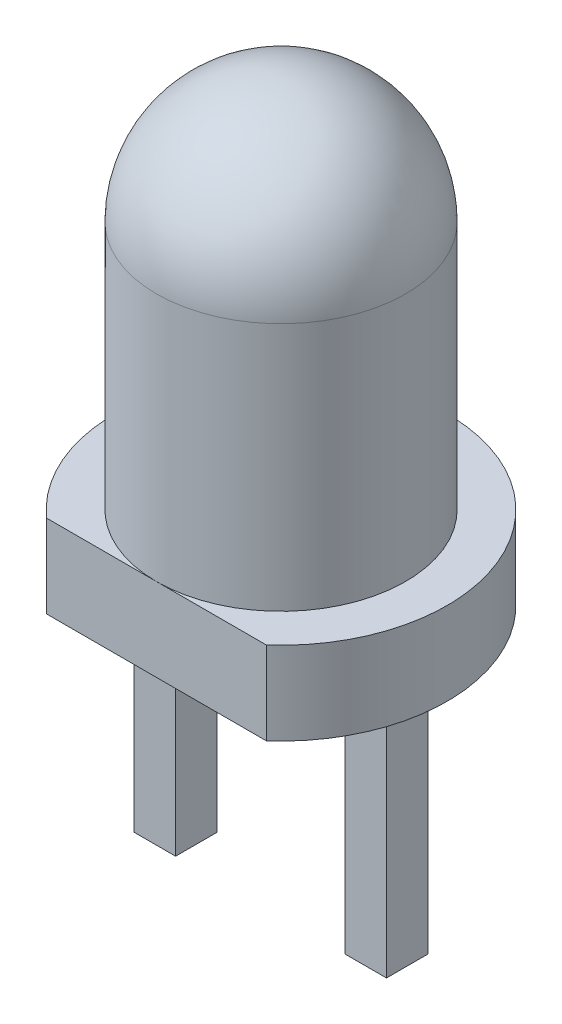
ISO-10303-21;
HEADER;
FILE_DESCRIPTION(('STEP AP214'),'2;1');
FILE_NAME('part.step','',(''),(''),'','','');
FILE_SCHEMA(('AUTOMOTIVE_DESIGN { 1 0 10303 214 1 1 1 1 }'));
ENDSEC;
DATA;
#1=APPLICATION_CONTEXT('core data for automotive mechanical design processes');
#2=APPLICATION_PROTOCOL_DEFINITION('international standard','automotive_design',2000,#1);
#3=PRODUCT_CONTEXT('',#1,'mechanical');
#4=PRODUCT('Part','Part','',(#3));
#5=PRODUCT_RELATED_PRODUCT_CATEGORY('part','',(#4));
#6=PRODUCT_DEFINITION_FORMATION('','',#4);
#7=PRODUCT_DEFINITION_CONTEXT('part definition',#1,'design');
#8=PRODUCT_DEFINITION('design','',#6,#7);
#9=PRODUCT_DEFINITION_SHAPE('','',#8);
#10=(LENGTH_UNIT() NAMED_UNIT(*) SI_UNIT(.MILLI.,.METRE.));
#11=(NAMED_UNIT(*) PLANE_ANGLE_UNIT() SI_UNIT($,.RADIAN.));
#12=(NAMED_UNIT(*) SI_UNIT($,.STERADIAN.) SOLID_ANGLE_UNIT());
#13=UNCERTAINTY_MEASURE_WITH_UNIT(LENGTH_MEASURE(1.E-05),#10,'distance_accuracy_value','');
#14=(GEOMETRIC_REPRESENTATION_CONTEXT(3) GLOBAL_UNCERTAINTY_ASSIGNED_CONTEXT((#13)) GLOBAL_UNIT_ASSIGNED_CONTEXT((#10,
#11,#12)) REPRESENTATION_CONTEXT('',''));
#15=CARTESIAN_POINT('',(0.,0.,0.));
#16=DIRECTION('',(0.,0.,1.));
#17=DIRECTION('',(1.,0.,0.));
#18=AXIS2_PLACEMENT_3D('',#15,#16,#17);
#19=CARTESIAN_POINT('',(1.02,-3.5,0.25));
#20=DIRECTION('',(1.,0.,0.));
#21=DIRECTION('',(0.,0.,-1.));
#22=AXIS2_PLACEMENT_3D('',#19,#20,#21);
#23=PLANE('',#22);
#24=DIRECTION('',(0.,0.,-1.));
#25=VECTOR('',#24,1.);
#26=CARTESIAN_POINT('',(1.02,-0.5,0.25));
#27=LINE('',#26,#25);
#28=CARTESIAN_POINT('',(1.02,-0.5,0.25));
#29=VERTEX_POINT('',#28);
#30=CARTESIAN_POINT('',(1.02,-0.5,-0.25));
#31=VERTEX_POINT('',#30);
#32=EDGE_CURVE('E12',#29,#31,#27,.T.);
#33=ORIENTED_EDGE('',*,*,#32,.T.);
#34=DIRECTION('',(0.,1.,0.));
#35=VECTOR('',#34,1.);
#36=CARTESIAN_POINT('',(1.02,-3.5,-0.25));
#37=LINE('',#36,#35);
#38=CARTESIAN_POINT('',(1.02,-3.5,-0.25));
#39=VERTEX_POINT('',#38);
#40=EDGE_CURVE('E123',#39,#31,#37,.T.);
#41=ORIENTED_EDGE('',*,*,#40,.F.);
#42=DIRECTION('',(0.,0.,-1.));
#43=VECTOR('',#42,1.);
#44=CARTESIAN_POINT('',(1.02,-3.5,0.25));
#45=LINE('',#44,#43);
#46=CARTESIAN_POINT('',(1.02,-3.5,0.25));
#47=VERTEX_POINT('',#46);
#48=EDGE_CURVE('E56',#47,#39,#45,.T.);
#49=ORIENTED_EDGE('',*,*,#48,.F.);
#50=DIRECTION('',(0.,1.,0.));
#51=VECTOR('',#50,1.);
#52=CARTESIAN_POINT('',(1.02,-3.5,0.25));
#53=LINE('',#52,#51);
#54=EDGE_CURVE('E111',#47,#29,#53,.T.);
#55=ORIENTED_EDGE('',*,*,#54,.T.);
#56=EDGE_LOOP('',(#33,#41,#49,#55));
#57=FACE_BOUND('',#56,.T.);
#58=ADVANCED_FACE('F52',(#57),#23,.F.);
#59=CARTESIAN_POINT('',(1.02,-3.5,-0.25));
#60=DIRECTION('',(0.,0.,1.));
#61=DIRECTION('',(1.,0.,0.));
#62=AXIS2_PLACEMENT_3D('',#59,#60,#61);
#63=PLANE('',#62);
#64=DIRECTION('',(1.,0.,0.));
#65=VECTOR('',#64,1.);
#66=CARTESIAN_POINT('',(1.02,-0.5,-0.25));
#67=LINE('',#66,#65);
#68=CARTESIAN_POINT('',(1.52,-0.5,-0.25));
#69=VERTEX_POINT('',#68);
#70=EDGE_CURVE('E62',#31,#69,#67,.T.);
#71=ORIENTED_EDGE('',*,*,#70,.T.);
#72=DIRECTION('',(0.,1.,0.));
#73=VECTOR('',#72,1.);
#74=CARTESIAN_POINT('',(1.52,-3.5,-0.25));
#75=LINE('',#74,#73);
#76=CARTESIAN_POINT('',(1.52,-3.5,-0.25));
#77=VERTEX_POINT('',#76);
#78=EDGE_CURVE('E107',#77,#69,#75,.T.);
#79=ORIENTED_EDGE('',*,*,#78,.F.);
#80=DIRECTION('',(1.,0.,0.));
#81=VECTOR('',#80,1.);
#82=CARTESIAN_POINT('',(1.02,-3.5,-0.25));
#83=LINE('',#82,#81);
#84=EDGE_CURVE('E86',#39,#77,#83,.T.);
#85=ORIENTED_EDGE('',*,*,#84,.F.);
#86=ORIENTED_EDGE('',*,*,#40,.T.);
#87=EDGE_LOOP('',(#71,#79,#85,#86));
#88=FACE_BOUND('',#87,.T.);
#89=ADVANCED_FACE('F126',(#88),#63,.F.);
#90=CARTESIAN_POINT('',(1.52,-3.5,0.25));
#91=DIRECTION('',(-1.,0.,0.));
#92=DIRECTION('',(0.,0.,1.));
#93=AXIS2_PLACEMENT_3D('',#90,#91,#92);
#94=PLANE('',#93);
#95=DIRECTION('',(0.,0.,1.));
#96=VECTOR('',#95,1.);
#97=CARTESIAN_POINT('',(1.52,-0.5,0.25));
#98=LINE('',#97,#96);
#99=CARTESIAN_POINT('',(1.52,-0.5,0.25));
#100=VERTEX_POINT('',#99);
#101=EDGE_CURVE('E102',#69,#100,#98,.T.);
#102=ORIENTED_EDGE('',*,*,#101,.T.);
#103=DIRECTION('',(0.,1.,0.));
#104=VECTOR('',#103,1.);
#105=CARTESIAN_POINT('',(1.52,-3.5,0.25));
#106=LINE('',#105,#104);
#107=CARTESIAN_POINT('',(1.52,-3.5,0.25));
#108=VERTEX_POINT('',#107);
#109=EDGE_CURVE('E105',#108,#100,#106,.T.);
#110=ORIENTED_EDGE('',*,*,#109,.F.);
#111=DIRECTION('',(0.,0.,1.));
#112=VECTOR('',#111,1.);
#113=CARTESIAN_POINT('',(1.52,-3.5,0.25));
#114=LINE('',#113,#112);
#115=EDGE_CURVE('E119',#77,#108,#114,.T.);
#116=ORIENTED_EDGE('',*,*,#115,.F.);
#117=ORIENTED_EDGE('',*,*,#78,.T.);
#118=EDGE_LOOP('',(#102,#110,#116,#117));
#119=FACE_BOUND('',#118,.T.);
#120=ADVANCED_FACE('F103',(#119),#94,.F.);
#121=CARTESIAN_POINT('',(1.02,-3.5,0.25));
#122=DIRECTION('',(0.,0.,-1.));
#123=DIRECTION('',(-1.,0.,0.));
#124=AXIS2_PLACEMENT_3D('',#121,#122,#123);
#125=PLANE('',#124);
#126=DIRECTION('',(-1.,0.,0.));
#127=VECTOR('',#126,1.);
#128=CARTESIAN_POINT('',(1.02,-0.5,0.25));
#129=LINE('',#128,#127);
#130=EDGE_CURVE('E96',#100,#29,#129,.T.);
#131=ORIENTED_EDGE('',*,*,#130,.T.);
#132=ORIENTED_EDGE('',*,*,#54,.F.);
#133=DIRECTION('',(-1.,0.,0.));
#134=VECTOR('',#133,1.);
#135=CARTESIAN_POINT('',(1.02,-3.5,0.25));
#136=LINE('',#135,#134);
#137=EDGE_CURVE('E110',#108,#47,#136,.T.);
#138=ORIENTED_EDGE('',*,*,#137,.F.);
#139=ORIENTED_EDGE('',*,*,#109,.T.);
#140=EDGE_LOOP('',(#131,#132,#138,#139));
#141=FACE_BOUND('',#140,.T.);
#142=ADVANCED_FACE('F109',(#141),#125,.F.);
#143=CARTESIAN_POINT('',(0.,-3.5,0.));
#144=DIRECTION('',(0.,-1.,0.));
#145=DIRECTION('',(0.,0.,-1.));
#146=AXIS2_PLACEMENT_3D('',#143,#144,#145);
#147=PLANE('',#146);
#148=ORIENTED_EDGE('',*,*,#48,.T.);
#149=ORIENTED_EDGE('',*,*,#84,.T.);
#150=ORIENTED_EDGE('',*,*,#115,.T.);
#151=ORIENTED_EDGE('',*,*,#137,.T.);
#152=EDGE_LOOP('',(#148,#149,#150,#151));
#153=FACE_BOUND('',#152,.T.);
#154=ADVANCED_FACE('F54',(#153),#147,.T.);
#155=CARTESIAN_POINT('',(0.,-0.5,0.));
#156=DIRECTION('',(0.,-1.,0.));
#157=DIRECTION('',(0.,0.,-1.));
#158=AXIS2_PLACEMENT_3D('',#155,#156,#157);
#159=PLANE('',#158);
#160=ORIENTED_EDGE('',*,*,#32,.F.);
#161=ORIENTED_EDGE('',*,*,#130,.F.);
#162=ORIENTED_EDGE('',*,*,#101,.F.);
#163=ORIENTED_EDGE('',*,*,#70,.F.);
#164=EDGE_LOOP('',(#160,#161,#162,#163));
#165=FACE_BOUND('',#164,.T.);
#166=ADVANCED_FACE('F113',(#165),#159,.F.);
#167=CLOSED_SHELL('',(#58,#89,#120,#142,#154,#166));
#168=MANIFOLD_SOLID_BREP('B2',#167);
#169=CARTESIAN_POINT('',(-1.52,-3.5,0.25));
#170=DIRECTION('',(1.,0.,0.));
#171=DIRECTION('',(0.,0.,-1.));
#172=AXIS2_PLACEMENT_3D('',#169,#170,#171);
#173=PLANE('',#172);
#174=DIRECTION('',(0.,0.,-1.));
#175=VECTOR('',#174,1.);
#176=CARTESIAN_POINT('',(-1.52,-0.5,0.25));
#177=LINE('',#176,#175);
#178=CARTESIAN_POINT('',(-1.52,-0.5,0.25));
#179=VERTEX_POINT('',#178);
#180=CARTESIAN_POINT('',(-1.52,-0.5,-0.25));
#181=VERTEX_POINT('',#180);
#182=EDGE_CURVE('E260',#179,#181,#177,.T.);
#183=ORIENTED_EDGE('',*,*,#182,.T.);
#184=DIRECTION('',(0.,1.,0.));
#185=VECTOR('',#184,1.);
#186=CARTESIAN_POINT('',(-1.52,-3.5,-0.25));
#187=LINE('',#186,#185);
#188=CARTESIAN_POINT('',(-1.52,-3.5,-0.25));
#189=VERTEX_POINT('',#188);
#190=EDGE_CURVE('E50',#189,#181,#187,.T.);
#191=ORIENTED_EDGE('',*,*,#190,.F.);
#192=DIRECTION('',(0.,0.,-1.));
#193=VECTOR('',#192,1.);
#194=CARTESIAN_POINT('',(-1.52,-3.5,0.25));
#195=LINE('',#194,#193);
#196=CARTESIAN_POINT('',(-1.52,-3.5,0.25));
#197=VERTEX_POINT('',#196);
#198=EDGE_CURVE('E248',#197,#189,#195,.T.);
#199=ORIENTED_EDGE('',*,*,#198,.F.);
#200=DIRECTION('',(0.,1.,0.));
#201=VECTOR('',#200,1.);
#202=CARTESIAN_POINT('',(-1.52,-3.5,0.25));
#203=LINE('',#202,#201);
#204=EDGE_CURVE('E256',#197,#179,#203,.T.);
#205=ORIENTED_EDGE('',*,*,#204,.T.);
#206=EDGE_LOOP('',(#183,#191,#199,#205));
#207=FACE_BOUND('',#206,.T.);
#208=ADVANCED_FACE('F197',(#207),#173,.F.);
#209=CARTESIAN_POINT('',(-1.52,-3.5,-0.25));
#210=DIRECTION('',(0.,0.,1.));
#211=DIRECTION('',(1.,0.,0.));
#212=AXIS2_PLACEMENT_3D('',#209,#210,#211);
#213=PLANE('',#212);
#214=DIRECTION('',(1.,0.,0.));
#215=VECTOR('',#214,1.);
#216=CARTESIAN_POINT('',(-1.52,-0.5,-0.25));
#217=LINE('',#216,#215);
#218=CARTESIAN_POINT('',(-1.02,-0.5,-0.25));
#219=VERTEX_POINT('',#218);
#220=EDGE_CURVE('E252',#181,#219,#217,.T.);
#221=ORIENTED_EDGE('',*,*,#220,.T.);
#222=DIRECTION('',(0.,1.,0.));
#223=VECTOR('',#222,1.);
#224=CARTESIAN_POINT('',(-1.02,-3.5,-0.25));
#225=LINE('',#224,#223);
#226=CARTESIAN_POINT('',(-1.02,-3.5,-0.25));
#227=VERTEX_POINT('',#226);
#228=EDGE_CURVE('E205',#227,#219,#225,.T.);
#229=ORIENTED_EDGE('',*,*,#228,.F.);
#230=DIRECTION('',(1.,0.,0.));
#231=VECTOR('',#230,1.);
#232=CARTESIAN_POINT('',(-1.52,-3.5,-0.25));
#233=LINE('',#232,#231);
#234=EDGE_CURVE('E243',#189,#227,#233,.T.);
#235=ORIENTED_EDGE('',*,*,#234,.F.);
#236=ORIENTED_EDGE('',*,*,#190,.T.);
#237=EDGE_LOOP('',(#221,#229,#235,#236));
#238=FACE_BOUND('',#237,.T.);
#239=ADVANCED_FACE('F251',(#238),#213,.F.);
#240=CARTESIAN_POINT('',(-1.02,-3.5,0.25));
#241=DIRECTION('',(-1.,0.,0.));
#242=DIRECTION('',(0.,0.,1.));
#243=AXIS2_PLACEMENT_3D('',#240,#241,#242);
#244=PLANE('',#243);
#245=DIRECTION('',(0.,0.,1.));
#246=VECTOR('',#245,1.);
#247=CARTESIAN_POINT('',(-1.02,-0.5,0.25));
#248=LINE('',#247,#246);
#249=CARTESIAN_POINT('',(-1.02,-0.5,0.25));
#250=VERTEX_POINT('',#249);
#251=EDGE_CURVE('E230',#219,#250,#248,.T.);
#252=ORIENTED_EDGE('',*,*,#251,.T.);
#253=DIRECTION('',(0.,1.,0.));
#254=VECTOR('',#253,1.);
#255=CARTESIAN_POINT('',(-1.02,-3.5,0.25));
#256=LINE('',#255,#254);
#257=CARTESIAN_POINT('',(-1.02,-3.5,0.25));
#258=VERTEX_POINT('',#257);
#259=EDGE_CURVE('E253',#258,#250,#256,.T.);
#260=ORIENTED_EDGE('',*,*,#259,.F.);
#261=DIRECTION('',(0.,0.,1.));
#262=VECTOR('',#261,1.);
#263=CARTESIAN_POINT('',(-1.02,-3.5,0.25));
#264=LINE('',#263,#262);
#265=EDGE_CURVE('E246',#227,#258,#264,.T.);
#266=ORIENTED_EDGE('',*,*,#265,.F.);
#267=ORIENTED_EDGE('',*,*,#228,.T.);
#268=EDGE_LOOP('',(#252,#260,#266,#267));
#269=FACE_BOUND('',#268,.T.);
#270=ADVANCED_FACE('F254',(#269),#244,.F.);
#271=CARTESIAN_POINT('',(-1.52,-3.5,0.25));
#272=DIRECTION('',(0.,0.,-1.));
#273=DIRECTION('',(-1.,0.,0.));
#274=AXIS2_PLACEMENT_3D('',#271,#272,#273);
#275=PLANE('',#274);
#276=DIRECTION('',(-1.,0.,0.));
#277=VECTOR('',#276,1.);
#278=CARTESIAN_POINT('',(-1.52,-0.5,0.25));
#279=LINE('',#278,#277);
#280=EDGE_CURVE('E236',#250,#179,#279,.T.);
#281=ORIENTED_EDGE('',*,*,#280,.T.);
#282=ORIENTED_EDGE('',*,*,#204,.F.);
#283=DIRECTION('',(-1.,0.,0.));
#284=VECTOR('',#283,1.);
#285=CARTESIAN_POINT('',(-1.52,-3.5,0.25));
#286=LINE('',#285,#284);
#287=EDGE_CURVE('E213',#258,#197,#286,.T.);
#288=ORIENTED_EDGE('',*,*,#287,.F.);
#289=ORIENTED_EDGE('',*,*,#259,.T.);
#290=EDGE_LOOP('',(#281,#282,#288,#289));
#291=FACE_BOUND('',#290,.T.);
#292=ADVANCED_FACE('F267',(#291),#275,.F.);
#293=CARTESIAN_POINT('',(0.,-3.5,0.));
#294=DIRECTION('',(0.,-1.,0.));
#295=DIRECTION('',(0.,0.,-1.));
#296=AXIS2_PLACEMENT_3D('',#293,#294,#295);
#297=PLANE('',#296);
#298=ORIENTED_EDGE('',*,*,#198,.T.);
#299=ORIENTED_EDGE('',*,*,#234,.T.);
#300=ORIENTED_EDGE('',*,*,#265,.T.);
#301=ORIENTED_EDGE('',*,*,#287,.T.);
#302=EDGE_LOOP('',(#298,#299,#300,#301));
#303=FACE_BOUND('',#302,.T.);
#304=ADVANCED_FACE('F244',(#303),#297,.T.);
#305=CARTESIAN_POINT('',(0.,-0.5,0.));
#306=DIRECTION('',(0.,-1.,0.));
#307=DIRECTION('',(0.,0.,-1.));
#308=AXIS2_PLACEMENT_3D('',#305,#306,#307);
#309=PLANE('',#308);
#310=ORIENTED_EDGE('',*,*,#182,.F.);
#311=ORIENTED_EDGE('',*,*,#280,.F.);
#312=ORIENTED_EDGE('',*,*,#251,.F.);
#313=ORIENTED_EDGE('',*,*,#220,.F.);
#314=EDGE_LOOP('',(#310,#311,#312,#313));
#315=FACE_BOUND('',#314,.T.);
#316=ADVANCED_FACE('F270',(#315),#309,.F.);
#317=CLOSED_SHELL('',(#208,#239,#270,#292,#304,#316));
#318=MANIFOLD_SOLID_BREP('B6',#317);
#319=CARTESIAN_POINT('',(0.,5.,0.));
#320=DIRECTION('',(0.,1.,0.));
#321=DIRECTION('',(0.,0.,1.));
#322=AXIS2_PLACEMENT_3D('',#319,#320,#321);
#323=CYLINDRICAL_SURFACE('',#322,1.5);
#324=CARTESIAN_POINT('',(0.,0.5,0.));
#325=DIRECTION('',(0.,1.,0.));
#326=DIRECTION('',(0.,0.,1.));
#327=AXIS2_PLACEMENT_3D('',#324,#325,#326);
#328=CIRCLE('',#327,1.5);
#329=CARTESIAN_POINT('',(0.,0.5,1.5));
#330=VERTEX_POINT('',#329);
#331=EDGE_CURVE('E195',#330,#330,#328,.F.);
#332=ORIENTED_EDGE('',*,*,#331,.F.);
#333=EDGE_LOOP('',(#332));
#334=FACE_BOUND('',#333,.T.);
#335=CARTESIAN_POINT('',(0.,3.5,0.));
#336=DIRECTION('',(0.,1.,0.));
#337=DIRECTION('',(0.,0.,1.));
#338=AXIS2_PLACEMENT_3D('',#335,#336,#337);
#339=CIRCLE('',#338,1.5);
#340=CARTESIAN_POINT('',(0.,3.5,1.5));
#341=VERTEX_POINT('',#340);
#342=EDGE_CURVE('E340',#341,#341,#339,.T.);
#343=ORIENTED_EDGE('',*,*,#342,.F.);
#344=EDGE_LOOP('',(#343));
#345=FACE_BOUND('',#344,.T.);
#346=ADVANCED_FACE('F333',(#334,#345),#323,.T.);
#347=CARTESIAN_POINT('',(0.,3.5,0.));
#348=DIRECTION('',(0.,1.,0.));
#349=DIRECTION('',(0.,0.,1.));
#350=AXIS2_PLACEMENT_3D('',#347,#348,#349);
#351=SPHERICAL_SURFACE('',#350,1.5);
#352=ORIENTED_EDGE('',*,*,#342,.T.);
#353=EDGE_LOOP('',(#352));
#354=FACE_BOUND('',#353,.T.);
#355=ADVANCED_FACE('F386',(#354),#351,.T.);
#356=CARTESIAN_POINT('',(0.,0.5,0.));
#357=DIRECTION('',(0.,-1.,0.));
#358=DIRECTION('',(0.,0.,-1.));
#359=AXIS2_PLACEMENT_3D('',#356,#357,#358);
#360=CYLINDRICAL_SURFACE('',#359,2.);
#361=CARTESIAN_POINT('',(0.,-0.5,0.));
#362=DIRECTION('',(0.,1.,0.));
#363=DIRECTION('',(0.,0.,1.));
#364=AXIS2_PLACEMENT_3D('',#361,#362,#363);
#365=CIRCLE('',#364,2.);
#366=CARTESIAN_POINT('',(1.3228756555323,-0.5,1.5));
#367=VERTEX_POINT('',#366);
#368=CARTESIAN_POINT('',(-1.3228756555323,-0.5,1.5));
#369=VERTEX_POINT('',#368);
#370=EDGE_CURVE('E372',#367,#369,#365,.T.);
#371=ORIENTED_EDGE('',*,*,#370,.T.);
#372=DIRECTION('',(0.,-1.,0.));
#373=VECTOR('',#372,1.);
#374=CARTESIAN_POINT('',(-1.3228756555323,0.5,1.5));
#375=LINE('',#374,#373);
#376=CARTESIAN_POINT('',(-1.3228756555323,0.5,1.5));
#377=VERTEX_POINT('',#376);
#378=EDGE_CURVE('E367',#377,#369,#375,.T.);
#379=ORIENTED_EDGE('',*,*,#378,.F.);
#380=CARTESIAN_POINT('',(0.,0.5,0.));
#381=DIRECTION('',(0.,1.,0.));
#382=DIRECTION('',(0.,0.,1.));
#383=AXIS2_PLACEMENT_3D('',#380,#381,#382);
#384=CIRCLE('',#383,2.);
#385=CARTESIAN_POINT('',(1.3228756555323,0.5,1.5));
#386=VERTEX_POINT('',#385);
#387=EDGE_CURVE('E371',#386,#377,#384,.T.);
#388=ORIENTED_EDGE('',*,*,#387,.F.);
#389=DIRECTION('',(0.,-1.,0.));
#390=VECTOR('',#389,1.);
#391=CARTESIAN_POINT('',(1.3228756555323,0.5,1.5));
#392=LINE('',#391,#390);
#393=EDGE_CURVE('E364',#386,#367,#392,.T.);
#394=ORIENTED_EDGE('',*,*,#393,.T.);
#395=EDGE_LOOP('',(#371,#379,#388,#394));
#396=FACE_BOUND('',#395,.T.);
#397=ADVANCED_FACE('F375',(#396),#360,.T.);
#398=CARTESIAN_POINT('',(-1.3228756555323,0.5,1.5));
#399=DIRECTION('',(0.,0.,-1.));
#400=DIRECTION('',(-1.,0.,0.));
#401=AXIS2_PLACEMENT_3D('',#398,#399,#400);
#402=PLANE('',#401);
#403=DIRECTION('',(1.,0.,0.));
#404=VECTOR('',#403,1.);
#405=CARTESIAN_POINT('',(-1.3228756555323,-0.5,1.5));
#406=LINE('',#405,#404);
#407=EDGE_CURVE('E361',#369,#367,#406,.T.);
#408=ORIENTED_EDGE('',*,*,#407,.T.);
#409=ORIENTED_EDGE('',*,*,#393,.F.);
#410=DIRECTION('',(1.,0.,0.));
#411=VECTOR('',#410,1.);
#412=CARTESIAN_POINT('',(-1.3228756555323,0.5,1.5));
#413=LINE('',#412,#411);
#414=EDGE_CURVE('E350',#330,#386,#413,.T.);
#415=ORIENTED_EDGE('',*,*,#414,.F.);
#416=EDGE_CURVE('E376',#377,#330,#413,.T.);
#417=ORIENTED_EDGE('',*,*,#416,.F.);
#418=ORIENTED_EDGE('',*,*,#378,.T.);
#419=EDGE_LOOP('',(#408,#409,#415,#417,#418));
#420=FACE_BOUND('',#419,.T.);
#421=ADVANCED_FACE('F363',(#420),#402,.F.);
#422=CARTESIAN_POINT('',(0.,0.5,0.));
#423=DIRECTION('',(0.,1.,0.));
#424=DIRECTION('',(0.,0.,1.));
#425=AXIS2_PLACEMENT_3D('',#422,#423,#424);
#426=PLANE('',#425);
#427=ORIENTED_EDGE('',*,*,#416,.T.);
#428=ORIENTED_EDGE('',*,*,#331,.T.);
#429=ORIENTED_EDGE('',*,*,#414,.T.);
#430=ORIENTED_EDGE('',*,*,#387,.T.);
#431=EDGE_LOOP('',(#427,#428,#429,#430));
#432=FACE_BOUND('',#431,.T.);
#433=ADVANCED_FACE('F399',(#432),#426,.T.);
#434=CARTESIAN_POINT('',(0.,-0.5,0.));
#435=DIRECTION('',(0.,1.,0.));
#436=DIRECTION('',(0.,0.,1.));
#437=AXIS2_PLACEMENT_3D('',#434,#435,#436);
#438=PLANE('',#437);
#439=ORIENTED_EDGE('',*,*,#370,.F.);
#440=ORIENTED_EDGE('',*,*,#407,.F.);
#441=EDGE_LOOP('',(#439,#440));
#442=FACE_BOUND('',#441,.T.);
#443=ADVANCED_FACE('F378',(#442),#438,.F.);
#444=CLOSED_SHELL('',(#346,#355,#397,#421,#433,#443));
#445=MANIFOLD_SOLID_BREP('B44',#444);
#446=ADVANCED_BREP_SHAPE_REPRESENTATION('',(#18,#168,#318,#445),#14);
#447=SHAPE_DEFINITION_REPRESENTATION(#9,#446);
ENDSEC;
END-ISO-10303-21;
